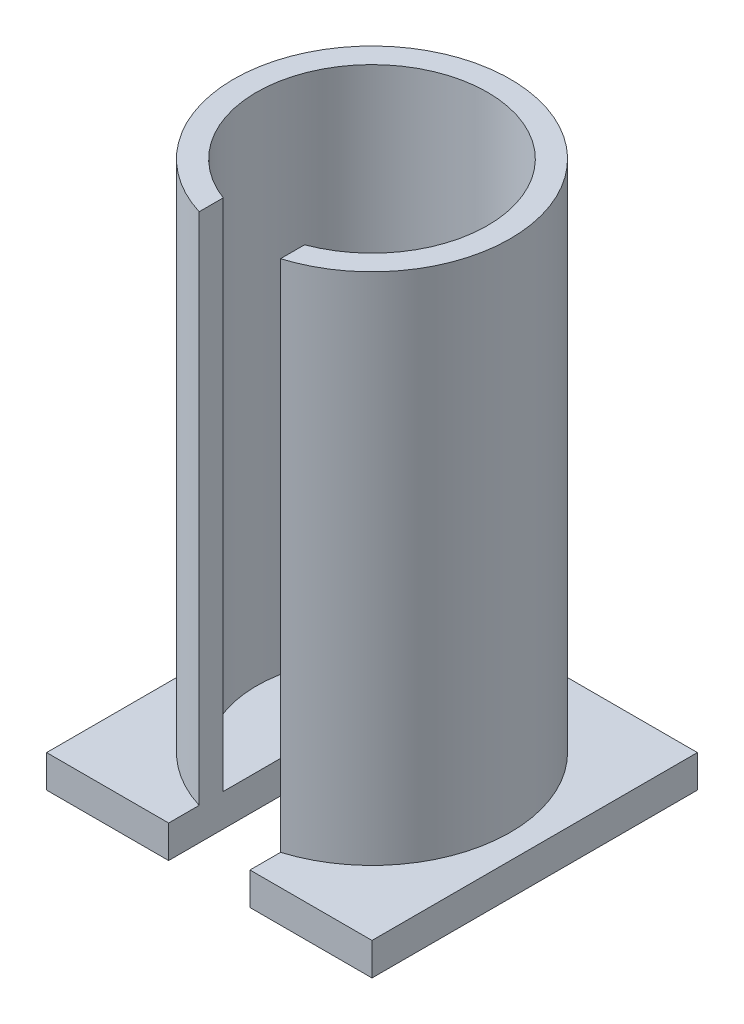
ISO-10303-21;
HEADER;
FILE_DESCRIPTION(('STEP AP214'),'2;1');
FILE_NAME('part.step','',(''),(''),'','','');
FILE_SCHEMA(('AUTOMOTIVE_DESIGN { 1 0 10303 214 1 1 1 1 }'));
ENDSEC;
DATA;
#1=APPLICATION_CONTEXT('core data for automotive mechanical design processes');
#2=APPLICATION_PROTOCOL_DEFINITION('international standard','automotive_design',2000,#1);
#3=PRODUCT_CONTEXT('',#1,'mechanical');
#4=PRODUCT('Part','Part','',(#3));
#5=PRODUCT_RELATED_PRODUCT_CATEGORY('part','',(#4));
#6=PRODUCT_DEFINITION_FORMATION('','',#4);
#7=PRODUCT_DEFINITION_CONTEXT('part definition',#1,'design');
#8=PRODUCT_DEFINITION('design','',#6,#7);
#9=PRODUCT_DEFINITION_SHAPE('','',#8);
#10=(LENGTH_UNIT() NAMED_UNIT(*) SI_UNIT(.MILLI.,.METRE.));
#11=(NAMED_UNIT(*) PLANE_ANGLE_UNIT() SI_UNIT($,.RADIAN.));
#12=(NAMED_UNIT(*) SI_UNIT($,.STERADIAN.) SOLID_ANGLE_UNIT());
#13=UNCERTAINTY_MEASURE_WITH_UNIT(LENGTH_MEASURE(1.E-05),#10,'distance_accuracy_value','');
#14=(GEOMETRIC_REPRESENTATION_CONTEXT(3) GLOBAL_UNCERTAINTY_ASSIGNED_CONTEXT((#13)) GLOBAL_UNIT_ASSIGNED_CONTEXT((#10,
#11,#12)) REPRESENTATION_CONTEXT('',''));
#15=CARTESIAN_POINT('',(0.,0.,0.));
#16=DIRECTION('',(0.,0.,1.));
#17=DIRECTION('',(1.,0.,0.));
#18=AXIS2_PLACEMENT_3D('',#15,#16,#17);
#19=CARTESIAN_POINT('',(0.,16.8,0.));
#20=DIRECTION('',(0.,-1.,0.));
#21=DIRECTION('',(0.,0.,-1.));
#22=AXIS2_PLACEMENT_3D('',#19,#20,#21);
#23=CYLINDRICAL_SURFACE('',#22,4.25);
#24=DIRECTION('',(0.,-1.,0.));
#25=VECTOR('',#24,1.);
#26=CARTESIAN_POINT('',(1.25,16.8,4.06201920231798));
#27=LINE('',#26,#25);
#28=CARTESIAN_POINT('',(1.25,16.8,4.06201920231798));
#29=VERTEX_POINT('',#28);
#30=CARTESIAN_POINT('',(1.25,1.,4.06201920231798));
#31=VERTEX_POINT('',#30);
#32=EDGE_CURVE('E56',#29,#31,#27,.T.);
#33=ORIENTED_EDGE('',*,*,#32,.T.);
#34=CARTESIAN_POINT('',(0.,1.,0.));
#35=DIRECTION('',(0.,1.,0.));
#36=DIRECTION('',(0.,0.,1.));
#37=AXIS2_PLACEMENT_3D('',#34,#35,#36);
#38=CIRCLE('',#37,4.25);
#39=CARTESIAN_POINT('',(-1.25,1.,4.06201920231798));
#40=VERTEX_POINT('',#39);
#41=EDGE_CURVE('E60',#31,#40,#38,.T.);
#42=ORIENTED_EDGE('',*,*,#41,.T.);
#43=DIRECTION('',(0.,-1.,0.));
#44=VECTOR('',#43,1.);
#45=CARTESIAN_POINT('',(-1.25,16.8,4.06201920231798));
#46=LINE('',#45,#44);
#47=CARTESIAN_POINT('',(-1.25,16.8,4.06201920231798));
#48=VERTEX_POINT('',#47);
#49=EDGE_CURVE('E236',#48,#40,#46,.T.);
#50=ORIENTED_EDGE('',*,*,#49,.F.);
#51=CARTESIAN_POINT('',(0.,16.8,0.));
#52=DIRECTION('',(0.,1.,0.));
#53=DIRECTION('',(0.,0.,1.));
#54=AXIS2_PLACEMENT_3D('',#51,#52,#53);
#55=CIRCLE('',#54,4.25);
#56=EDGE_CURVE('E244',#29,#48,#55,.T.);
#57=ORIENTED_EDGE('',*,*,#56,.F.);
#58=EDGE_LOOP('',(#33,#42,#50,#57));
#59=FACE_BOUND('',#58,.T.);
#60=ADVANCED_FACE('F41',(#59),#23,.T.);
#61=CARTESIAN_POINT('',(0.,16.8,0.));
#62=DIRECTION('',(0.,-1.,0.));
#63=DIRECTION('',(0.,0.,-1.));
#64=AXIS2_PLACEMENT_3D('',#61,#62,#63);
#65=CYLINDRICAL_SURFACE('',#64,3.55);
#66=CARTESIAN_POINT('',(0.,16.8,0.));
#67=DIRECTION('',(0.,1.,0.));
#68=DIRECTION('',(0.,0.,1.));
#69=AXIS2_PLACEMENT_3D('',#66,#67,#68);
#70=CIRCLE('',#69,3.55);
#71=CARTESIAN_POINT('',(1.25,16.8,3.32264954516723));
#72=VERTEX_POINT('',#71);
#73=CARTESIAN_POINT('',(-1.25,16.8,3.32264954516723));
#74=VERTEX_POINT('',#73);
#75=EDGE_CURVE('E251',#72,#74,#70,.T.);
#76=ORIENTED_EDGE('',*,*,#75,.T.);
#77=DIRECTION('',(0.,-1.,0.));
#78=VECTOR('',#77,1.);
#79=CARTESIAN_POINT('',(-1.25,16.8,3.32264954516723));
#80=LINE('',#79,#78);
#81=CARTESIAN_POINT('',(-1.25,1.,3.32264954516723));
#82=VERTEX_POINT('',#81);
#83=EDGE_CURVE('E228',#74,#82,#80,.T.);
#84=ORIENTED_EDGE('',*,*,#83,.T.);
#85=CARTESIAN_POINT('',(0.,1.,0.));
#86=DIRECTION('',(0.,1.,0.));
#87=DIRECTION('',(0.,0.,1.));
#88=AXIS2_PLACEMENT_3D('',#85,#86,#87);
#89=CIRCLE('',#88,3.55);
#90=CARTESIAN_POINT('',(1.25,1.,3.32264954516723));
#91=VERTEX_POINT('',#90);
#92=EDGE_CURVE('E255',#91,#82,#89,.T.);
#93=ORIENTED_EDGE('',*,*,#92,.F.);
#94=DIRECTION('',(0.,-1.,0.));
#95=VECTOR('',#94,1.);
#96=CARTESIAN_POINT('',(1.25,16.8,3.32264954516723));
#97=LINE('',#96,#95);
#98=EDGE_CURVE('E216',#72,#91,#97,.T.);
#99=ORIENTED_EDGE('',*,*,#98,.F.);
#100=EDGE_LOOP('',(#76,#84,#93,#99));
#101=FACE_BOUND('',#100,.T.);
#102=ADVANCED_FACE('F275',(#101),#65,.F.);
#103=CARTESIAN_POINT('',(0.,16.8,0.));
#104=DIRECTION('',(0.,1.,0.));
#105=DIRECTION('',(0.,0.,1.));
#106=AXIS2_PLACEMENT_3D('',#103,#104,#105);
#107=PLANE('',#106);
#108=ORIENTED_EDGE('',*,*,#56,.T.);
#109=DIRECTION('',(0.,0.,-1.));
#110=VECTOR('',#109,1.);
#111=CARTESIAN_POINT('',(-1.25,16.8,0.));
#112=LINE('',#111,#110);
#113=EDGE_CURVE('E232',#48,#74,#112,.T.);
#114=ORIENTED_EDGE('',*,*,#113,.T.);
#115=ORIENTED_EDGE('',*,*,#75,.F.);
#116=DIRECTION('',(0.,0.,-1.));
#117=VECTOR('',#116,1.);
#118=CARTESIAN_POINT('',(1.25,16.8,0.));
#119=LINE('',#118,#117);
#120=EDGE_CURVE('E219',#29,#72,#119,.T.);
#121=ORIENTED_EDGE('',*,*,#120,.F.);
#122=EDGE_LOOP('',(#108,#114,#115,#121));
#123=FACE_BOUND('',#122,.T.);
#124=ADVANCED_FACE('F278',(#123),#107,.T.);
#125=CARTESIAN_POINT('',(0.,0.,0.));
#126=DIRECTION('',(0.,1.,0.));
#127=DIRECTION('',(0.,0.,1.));
#128=AXIS2_PLACEMENT_3D('',#125,#126,#127);
#129=PLANE('',#128);
#130=DIRECTION('',(0.,0.,1.));
#131=VECTOR('',#130,1.);
#132=CARTESIAN_POINT('',(-1.25,0.,0.));
#133=LINE('',#132,#131);
#134=CARTESIAN_POINT('',(-1.25,0.,0.));
#135=VERTEX_POINT('',#134);
#136=CARTESIAN_POINT('',(-1.25,0.,5.));
#137=VERTEX_POINT('',#136);
#138=EDGE_CURVE('E208',#135,#137,#133,.T.);
#139=ORIENTED_EDGE('',*,*,#138,.T.);
#140=DIRECTION('',(-1.,0.,0.));
#141=VECTOR('',#140,1.);
#142=CARTESIAN_POINT('',(0.,0.,5.));
#143=LINE('',#142,#141);
#144=CARTESIAN_POINT('',(-5.,0.,5.));
#145=VERTEX_POINT('',#144);
#146=EDGE_CURVE('E137',#137,#145,#143,.T.);
#147=ORIENTED_EDGE('',*,*,#146,.T.);
#148=DIRECTION('',(0.,0.,-1.));
#149=VECTOR('',#148,1.);
#150=CARTESIAN_POINT('',(-5.,0.,0.));
#151=LINE('',#150,#149);
#152=CARTESIAN_POINT('',(-5.,0.,-5.));
#153=VERTEX_POINT('',#152);
#154=EDGE_CURVE('E187',#145,#153,#151,.T.);
#155=ORIENTED_EDGE('',*,*,#154,.T.);
#156=DIRECTION('',(-1.,0.,0.));
#157=VECTOR('',#156,1.);
#158=CARTESIAN_POINT('',(0.,0.,-5.));
#159=LINE('',#158,#157);
#160=CARTESIAN_POINT('',(5.,0.,-5.));
#161=VERTEX_POINT('',#160);
#162=EDGE_CURVE('E183',#161,#153,#159,.T.);
#163=ORIENTED_EDGE('',*,*,#162,.F.);
#164=DIRECTION('',(0.,0.,-1.));
#165=VECTOR('',#164,1.);
#166=CARTESIAN_POINT('',(5.,0.,0.));
#167=LINE('',#166,#165);
#168=CARTESIAN_POINT('',(5.,0.,5.));
#169=VERTEX_POINT('',#168);
#170=EDGE_CURVE('E180',#169,#161,#167,.T.);
#171=ORIENTED_EDGE('',*,*,#170,.F.);
#172=CARTESIAN_POINT('',(1.25,0.,5.));
#173=VERTEX_POINT('',#172);
#174=EDGE_CURVE('E177',#169,#173,#143,.T.);
#175=ORIENTED_EDGE('',*,*,#174,.T.);
#176=DIRECTION('',(0.,0.,1.));
#177=VECTOR('',#176,1.);
#178=CARTESIAN_POINT('',(1.25,0.,0.));
#179=LINE('',#178,#177);
#180=CARTESIAN_POINT('',(1.25,0.,0.));
#181=VERTEX_POINT('',#180);
#182=EDGE_CURVE('E143',#181,#173,#179,.T.);
#183=ORIENTED_EDGE('',*,*,#182,.F.);
#184=CARTESIAN_POINT('',(0.,0.,0.));
#185=DIRECTION('',(0.,1.,0.));
#186=DIRECTION('',(0.,0.,1.));
#187=AXIS2_PLACEMENT_3D('',#184,#185,#186);
#188=CIRCLE('',#187,1.25);
#189=EDGE_CURVE('E239',#181,#135,#188,.T.);
#190=ORIENTED_EDGE('',*,*,#189,.T.);
#191=EDGE_LOOP('',(#139,#147,#155,#163,#171,#175,#183,#190));
#192=FACE_BOUND('',#191,.T.);
#193=ADVANCED_FACE('F265',(#192),#129,.F.);
#194=CARTESIAN_POINT('',(0.,1.,0.));
#195=DIRECTION('',(0.,1.,0.));
#196=DIRECTION('',(0.,0.,1.));
#197=AXIS2_PLACEMENT_3D('',#194,#195,#196);
#198=PLANE('',#197);
#199=ORIENTED_EDGE('',*,*,#92,.T.);
#200=DIRECTION('',(0.,0.,-1.));
#201=VECTOR('',#200,1.);
#202=CARTESIAN_POINT('',(-1.25,1.,0.));
#203=LINE('',#202,#201);
#204=CARTESIAN_POINT('',(-1.25,1.,0.));
#205=VERTEX_POINT('',#204);
#206=EDGE_CURVE('E224',#82,#205,#203,.T.);
#207=ORIENTED_EDGE('',*,*,#206,.T.);
#208=CARTESIAN_POINT('',(0.,1.,0.));
#209=DIRECTION('',(0.,1.,0.));
#210=DIRECTION('',(0.,0.,1.));
#211=AXIS2_PLACEMENT_3D('',#208,#209,#210);
#212=CIRCLE('',#211,1.25);
#213=CARTESIAN_POINT('',(1.25,1.,0.));
#214=VERTEX_POINT('',#213);
#215=EDGE_CURVE('E240',#214,#205,#212,.T.);
#216=ORIENTED_EDGE('',*,*,#215,.F.);
#217=DIRECTION('',(0.,0.,-1.));
#218=VECTOR('',#217,1.);
#219=CARTESIAN_POINT('',(1.25,1.,0.));
#220=LINE('',#219,#218);
#221=EDGE_CURVE('E213',#91,#214,#220,.T.);
#222=ORIENTED_EDGE('',*,*,#221,.F.);
#223=EDGE_LOOP('',(#199,#207,#216,#222));
#224=FACE_BOUND('',#223,.T.);
#225=ADVANCED_FACE('F271',(#224),#198,.T.);
#226=CARTESIAN_POINT('',(0.,1.,0.));
#227=DIRECTION('',(0.,-1.,0.));
#228=DIRECTION('',(0.,0.,-1.));
#229=AXIS2_PLACEMENT_3D('',#226,#227,#228);
#230=CYLINDRICAL_SURFACE('',#229,1.25);
#231=ORIENTED_EDGE('',*,*,#215,.T.);
#232=DIRECTION('',(0.,-1.,0.));
#233=VECTOR('',#232,1.);
#234=CARTESIAN_POINT('',(-1.25,1.,0.));
#235=LINE('',#234,#233);
#236=EDGE_CURVE('E11',#205,#135,#235,.T.);
#237=ORIENTED_EDGE('',*,*,#236,.T.);
#238=ORIENTED_EDGE('',*,*,#189,.F.);
#239=DIRECTION('',(0.,-1.,0.));
#240=VECTOR('',#239,1.);
#241=CARTESIAN_POINT('',(1.25,1.,0.));
#242=LINE('',#241,#240);
#243=EDGE_CURVE('E49',#214,#181,#242,.T.);
#244=ORIENTED_EDGE('',*,*,#243,.F.);
#245=EDGE_LOOP('',(#231,#237,#238,#244));
#246=FACE_BOUND('',#245,.T.);
#247=ADVANCED_FACE('F267',(#246),#230,.F.);
#248=CARTESIAN_POINT('',(1.25,18.,0.));
#249=DIRECTION('',(1.,0.,0.));
#250=DIRECTION('',(0.,0.,-1.));
#251=AXIS2_PLACEMENT_3D('',#248,#249,#250);
#252=PLANE('',#251);
#253=ORIENTED_EDGE('',*,*,#98,.T.);
#254=ORIENTED_EDGE('',*,*,#221,.T.);
#255=ORIENTED_EDGE('',*,*,#243,.T.);
#256=ORIENTED_EDGE('',*,*,#182,.T.);
#257=DIRECTION('',(0.,-1.,0.));
#258=VECTOR('',#257,1.);
#259=CARTESIAN_POINT('',(1.25,1.,5.));
#260=LINE('',#259,#258);
#261=CARTESIAN_POINT('',(1.25,1.,5.));
#262=VERTEX_POINT('',#261);
#263=EDGE_CURVE('E140',#262,#173,#260,.T.);
#264=ORIENTED_EDGE('',*,*,#263,.F.);
#265=DIRECTION('',(0.,0.,1.));
#266=VECTOR('',#265,1.);
#267=CARTESIAN_POINT('',(1.25,1.,0.));
#268=LINE('',#267,#266);
#269=EDGE_CURVE('E129',#31,#262,#268,.T.);
#270=ORIENTED_EDGE('',*,*,#269,.F.);
#271=ORIENTED_EDGE('',*,*,#32,.F.);
#272=ORIENTED_EDGE('',*,*,#120,.T.);
#273=EDGE_LOOP('',(#253,#254,#255,#256,#264,#270,#271,#272));
#274=FACE_BOUND('',#273,.T.);
#275=ADVANCED_FACE('F141',(#274),#252,.F.);
#276=CARTESIAN_POINT('',(-1.25,18.,0.));
#277=DIRECTION('',(1.,0.,0.));
#278=DIRECTION('',(0.,0.,-1.));
#279=AXIS2_PLACEMENT_3D('',#276,#277,#278);
#280=PLANE('',#279);
#281=ORIENTED_EDGE('',*,*,#49,.T.);
#282=DIRECTION('',(0.,0.,1.));
#283=VECTOR('',#282,1.);
#284=CARTESIAN_POINT('',(-1.25,1.,0.));
#285=LINE('',#284,#283);
#286=CARTESIAN_POINT('',(-1.25,1.,5.));
#287=VERTEX_POINT('',#286);
#288=EDGE_CURVE('E161',#40,#287,#285,.T.);
#289=ORIENTED_EDGE('',*,*,#288,.T.);
#290=DIRECTION('',(0.,-1.,0.));
#291=VECTOR('',#290,1.);
#292=CARTESIAN_POINT('',(-1.25,1.,5.));
#293=LINE('',#292,#291);
#294=EDGE_CURVE('E168',#287,#137,#293,.T.);
#295=ORIENTED_EDGE('',*,*,#294,.T.);
#296=ORIENTED_EDGE('',*,*,#138,.F.);
#297=ORIENTED_EDGE('',*,*,#236,.F.);
#298=ORIENTED_EDGE('',*,*,#206,.F.);
#299=ORIENTED_EDGE('',*,*,#83,.F.);
#300=ORIENTED_EDGE('',*,*,#113,.F.);
#301=EDGE_LOOP('',(#281,#289,#295,#296,#297,#298,#299,#300));
#302=FACE_BOUND('',#301,.T.);
#303=ADVANCED_FACE('F269',(#302),#280,.T.);
#304=CARTESIAN_POINT('',(0.,1.,0.));
#305=DIRECTION('',(0.,1.,0.));
#306=DIRECTION('',(0.,0.,1.));
#307=AXIS2_PLACEMENT_3D('',#304,#305,#306);
#308=PLANE('',#307);
#309=ORIENTED_EDGE('',*,*,#41,.F.);
#310=ORIENTED_EDGE('',*,*,#269,.T.);
#311=DIRECTION('',(-1.,0.,0.));
#312=VECTOR('',#311,1.);
#313=CARTESIAN_POINT('',(0.,1.,5.));
#314=LINE('',#313,#312);
#315=CARTESIAN_POINT('',(5.,1.,5.));
#316=VERTEX_POINT('',#315);
#317=EDGE_CURVE('E133',#316,#262,#314,.T.);
#318=ORIENTED_EDGE('',*,*,#317,.F.);
#319=DIRECTION('',(0.,0.,-1.));
#320=VECTOR('',#319,1.);
#321=CARTESIAN_POINT('',(5.,1.,0.));
#322=LINE('',#321,#320);
#323=CARTESIAN_POINT('',(5.,1.,-5.));
#324=VERTEX_POINT('',#323);
#325=EDGE_CURVE('E153',#316,#324,#322,.T.);
#326=ORIENTED_EDGE('',*,*,#325,.T.);
#327=DIRECTION('',(-1.,0.,0.));
#328=VECTOR('',#327,1.);
#329=CARTESIAN_POINT('',(0.,1.,-5.));
#330=LINE('',#329,#328);
#331=CARTESIAN_POINT('',(-5.,1.,-5.));
#332=VERTEX_POINT('',#331);
#333=EDGE_CURVE('E157',#324,#332,#330,.T.);
#334=ORIENTED_EDGE('',*,*,#333,.T.);
#335=DIRECTION('',(0.,0.,-1.));
#336=VECTOR('',#335,1.);
#337=CARTESIAN_POINT('',(-5.,1.,0.));
#338=LINE('',#337,#336);
#339=CARTESIAN_POINT('',(-5.,1.,5.));
#340=VERTEX_POINT('',#339);
#341=EDGE_CURVE('E162',#340,#332,#338,.T.);
#342=ORIENTED_EDGE('',*,*,#341,.F.);
#343=EDGE_CURVE('E155',#287,#340,#314,.T.);
#344=ORIENTED_EDGE('',*,*,#343,.F.);
#345=ORIENTED_EDGE('',*,*,#288,.F.);
#346=EDGE_LOOP('',(#309,#310,#318,#326,#334,#342,#344,#345));
#347=FACE_BOUND('',#346,.T.);
#348=ADVANCED_FACE('F131',(#347),#308,.T.);
#349=CARTESIAN_POINT('',(0.,1.,5.));
#350=DIRECTION('',(0.,0.,1.));
#351=DIRECTION('',(1.,0.,0.));
#352=AXIS2_PLACEMENT_3D('',#349,#350,#351);
#353=PLANE('',#352);
#354=ORIENTED_EDGE('',*,*,#174,.F.);
#355=DIRECTION('',(0.,-1.,0.));
#356=VECTOR('',#355,1.);
#357=CARTESIAN_POINT('',(5.,1.,5.));
#358=LINE('',#357,#356);
#359=EDGE_CURVE('E148',#316,#169,#358,.T.);
#360=ORIENTED_EDGE('',*,*,#359,.F.);
#361=ORIENTED_EDGE('',*,*,#317,.T.);
#362=ORIENTED_EDGE('',*,*,#263,.T.);
#363=EDGE_LOOP('',(#354,#360,#361,#362));
#364=FACE_BOUND('',#363,.T.);
#365=ADVANCED_FACE('F150',(#364),#353,.T.);
#366=CARTESIAN_POINT('',(5.,1.,0.));
#367=DIRECTION('',(-1.,0.,0.));
#368=DIRECTION('',(0.,0.,1.));
#369=AXIS2_PLACEMENT_3D('',#366,#367,#368);
#370=PLANE('',#369);
#371=ORIENTED_EDGE('',*,*,#170,.T.);
#372=DIRECTION('',(0.,-1.,0.));
#373=VECTOR('',#372,1.);
#374=CARTESIAN_POINT('',(5.,1.,-5.));
#375=LINE('',#374,#373);
#376=EDGE_CURVE('E200',#324,#161,#375,.T.);
#377=ORIENTED_EDGE('',*,*,#376,.F.);
#378=ORIENTED_EDGE('',*,*,#325,.F.);
#379=ORIENTED_EDGE('',*,*,#359,.T.);
#380=EDGE_LOOP('',(#371,#377,#378,#379));
#381=FACE_BOUND('',#380,.T.);
#382=ADVANCED_FACE('F300',(#381),#370,.F.);
#383=CARTESIAN_POINT('',(0.,1.,-5.));
#384=DIRECTION('',(0.,0.,1.));
#385=DIRECTION('',(1.,0.,0.));
#386=AXIS2_PLACEMENT_3D('',#383,#384,#385);
#387=PLANE('',#386);
#388=ORIENTED_EDGE('',*,*,#162,.T.);
#389=DIRECTION('',(0.,-1.,0.));
#390=VECTOR('',#389,1.);
#391=CARTESIAN_POINT('',(-5.,1.,-5.));
#392=LINE('',#391,#390);
#393=EDGE_CURVE('E197',#332,#153,#392,.T.);
#394=ORIENTED_EDGE('',*,*,#393,.F.);
#395=ORIENTED_EDGE('',*,*,#333,.F.);
#396=ORIENTED_EDGE('',*,*,#376,.T.);
#397=EDGE_LOOP('',(#388,#394,#395,#396));
#398=FACE_BOUND('',#397,.T.);
#399=ADVANCED_FACE('F284',(#398),#387,.F.);
#400=CARTESIAN_POINT('',(-5.,1.,0.));
#401=DIRECTION('',(-1.,0.,0.));
#402=DIRECTION('',(0.,0.,1.));
#403=AXIS2_PLACEMENT_3D('',#400,#401,#402);
#404=PLANE('',#403);
#405=ORIENTED_EDGE('',*,*,#154,.F.);
#406=DIRECTION('',(0.,-1.,0.));
#407=VECTOR('',#406,1.);
#408=CARTESIAN_POINT('',(-5.,1.,5.));
#409=LINE('',#408,#407);
#410=EDGE_CURVE('E194',#340,#145,#409,.T.);
#411=ORIENTED_EDGE('',*,*,#410,.F.);
#412=ORIENTED_EDGE('',*,*,#341,.T.);
#413=ORIENTED_EDGE('',*,*,#393,.T.);
#414=EDGE_LOOP('',(#405,#411,#412,#413));
#415=FACE_BOUND('',#414,.T.);
#416=ADVANCED_FACE('F287',(#415),#404,.T.);
#417=ORIENTED_EDGE('',*,*,#146,.F.);
#418=ORIENTED_EDGE('',*,*,#294,.F.);
#419=ORIENTED_EDGE('',*,*,#343,.T.);
#420=ORIENTED_EDGE('',*,*,#410,.T.);
#421=EDGE_LOOP('',(#417,#418,#419,#420));
#422=FACE_BOUND('',#421,.T.);
#423=ADVANCED_FACE('F291',(#422),#353,.T.);
#424=CLOSED_SHELL('',(#60,#102,#124,#193,#225,#247,#275,#303,#348,#365,#382,#399,#416,#423));
#425=MANIFOLD_SOLID_BREP('B2',#424);
#426=ADVANCED_BREP_SHAPE_REPRESENTATION('',(#18,#425),#14);
#427=SHAPE_DEFINITION_REPRESENTATION(#9,#426);
ENDSEC;
END-ISO-10303-21;
